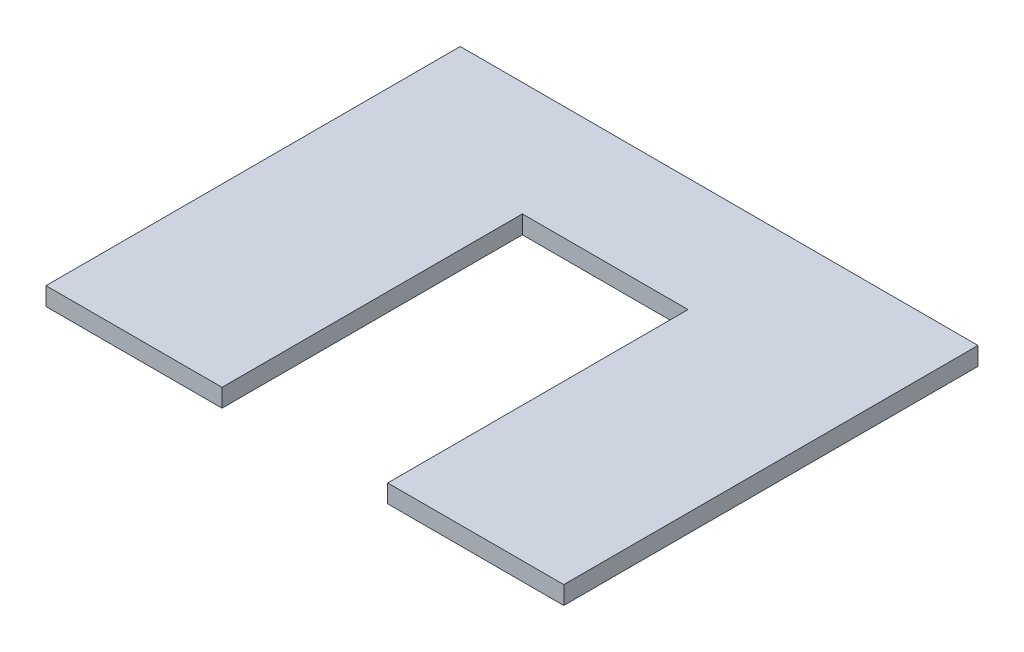
ISO-10303-21;
HEADER;
FILE_DESCRIPTION(('STEP AP214'),'2;1');
FILE_NAME('part.step','',(''),(''),'','','');
FILE_SCHEMA(('AUTOMOTIVE_DESIGN { 1 0 10303 214 1 1 1 1 }'));
ENDSEC;
DATA;
#1=APPLICATION_CONTEXT('core data for automotive mechanical design processes');
#2=APPLICATION_PROTOCOL_DEFINITION('international standard','automotive_design',2000,#1);
#3=PRODUCT_CONTEXT('',#1,'mechanical');
#4=PRODUCT('Part','Part','',(#3));
#5=PRODUCT_RELATED_PRODUCT_CATEGORY('part','',(#4));
#6=PRODUCT_DEFINITION_FORMATION('','',#4);
#7=PRODUCT_DEFINITION_CONTEXT('part definition',#1,'design');
#8=PRODUCT_DEFINITION('design','',#6,#7);
#9=PRODUCT_DEFINITION_SHAPE('','',#8);
#10=(LENGTH_UNIT() NAMED_UNIT(*) SI_UNIT(.MILLI.,.METRE.));
#11=(NAMED_UNIT(*) PLANE_ANGLE_UNIT() SI_UNIT($,.RADIAN.));
#12=(NAMED_UNIT(*) SI_UNIT($,.STERADIAN.) SOLID_ANGLE_UNIT());
#13=UNCERTAINTY_MEASURE_WITH_UNIT(LENGTH_MEASURE(1.E-05),#10,'distance_accuracy_value','');
#14=(GEOMETRIC_REPRESENTATION_CONTEXT(3) GLOBAL_UNCERTAINTY_ASSIGNED_CONTEXT((#13)) GLOBAL_UNIT_ASSIGNED_CONTEXT((#10,
#11,#12)) REPRESENTATION_CONTEXT('',''));
#15=CARTESIAN_POINT('',(0.,0.,0.));
#16=DIRECTION('',(0.,0.,1.));
#17=DIRECTION('',(1.,0.,0.));
#18=AXIS2_PLACEMENT_3D('',#15,#16,#17);
#19=CARTESIAN_POINT('',(0.,1.75,0.));
#20=DIRECTION('',(1.,0.,0.));
#21=DIRECTION('',(0.,0.,-1.));
#22=AXIS2_PLACEMENT_3D('',#19,#20,#21);
#23=PLANE('',#22);
#24=DIRECTION('',(0.,0.,1.));
#25=VECTOR('',#24,1.);
#26=CARTESIAN_POINT('',(0.,0.,0.));
#27=LINE('',#26,#25);
#28=CARTESIAN_POINT('',(0.,0.,0.));
#29=VERTEX_POINT('',#28);
#30=CARTESIAN_POINT('',(0.,0.,40.));
#31=VERTEX_POINT('',#30);
#32=EDGE_CURVE('E144',#29,#31,#27,.T.);
#33=ORIENTED_EDGE('',*,*,#32,.T.);
#34=DIRECTION('',(0.,-1.,0.));
#35=VECTOR('',#34,1.);
#36=CARTESIAN_POINT('',(0.,1.75,40.));
#37=LINE('',#36,#35);
#38=CARTESIAN_POINT('',(0.,1.75,40.));
#39=VERTEX_POINT('',#38);
#40=EDGE_CURVE('E11',#39,#31,#37,.T.);
#41=ORIENTED_EDGE('',*,*,#40,.F.);
#42=DIRECTION('',(0.,0.,1.));
#43=VECTOR('',#42,1.);
#44=CARTESIAN_POINT('',(0.,1.75,0.));
#45=LINE('',#44,#43);
#46=CARTESIAN_POINT('',(0.,1.75,0.));
#47=VERTEX_POINT('',#46);
#48=EDGE_CURVE('E166',#47,#39,#45,.T.);
#49=ORIENTED_EDGE('',*,*,#48,.F.);
#50=DIRECTION('',(0.,-1.,0.));
#51=VECTOR('',#50,1.);
#52=CARTESIAN_POINT('',(0.,1.75,0.));
#53=LINE('',#52,#51);
#54=EDGE_CURVE('E140',#47,#29,#53,.T.);
#55=ORIENTED_EDGE('',*,*,#54,.T.);
#56=EDGE_LOOP('',(#33,#41,#49,#55));
#57=FACE_BOUND('',#56,.T.);
#58=ADVANCED_FACE('F43',(#57),#23,.F.);
#59=CARTESIAN_POINT('',(0.,1.75,40.));
#60=DIRECTION('',(0.,0.,-1.));
#61=DIRECTION('',(-1.,0.,0.));
#62=AXIS2_PLACEMENT_3D('',#59,#60,#61);
#63=PLANE('',#62);
#64=DIRECTION('',(1.,0.,0.));
#65=VECTOR('',#64,1.);
#66=CARTESIAN_POINT('',(0.,0.,40.));
#67=LINE('',#66,#65);
#68=CARTESIAN_POINT('',(17.,0.,40.));
#69=VERTEX_POINT('',#68);
#70=EDGE_CURVE('E148',#31,#69,#67,.T.);
#71=ORIENTED_EDGE('',*,*,#70,.T.);
#72=DIRECTION('',(0.,-1.,0.));
#73=VECTOR('',#72,1.);
#74=CARTESIAN_POINT('',(17.,1.75,40.));
#75=LINE('',#74,#73);
#76=CARTESIAN_POINT('',(17.,1.75,40.));
#77=VERTEX_POINT('',#76);
#78=EDGE_CURVE('E52',#77,#69,#75,.T.);
#79=ORIENTED_EDGE('',*,*,#78,.F.);
#80=DIRECTION('',(1.,0.,0.));
#81=VECTOR('',#80,1.);
#82=CARTESIAN_POINT('',(0.,1.75,40.));
#83=LINE('',#82,#81);
#84=EDGE_CURVE('E103',#39,#77,#83,.T.);
#85=ORIENTED_EDGE('',*,*,#84,.F.);
#86=ORIENTED_EDGE('',*,*,#40,.T.);
#87=EDGE_LOOP('',(#71,#79,#85,#86));
#88=FACE_BOUND('',#87,.T.);
#89=ADVANCED_FACE('F212',(#88),#63,.F.);
#90=CARTESIAN_POINT('',(17.,1.75,40.));
#91=DIRECTION('',(-1.,0.,0.));
#92=DIRECTION('',(0.,0.,1.));
#93=AXIS2_PLACEMENT_3D('',#90,#91,#92);
#94=PLANE('',#93);
#95=DIRECTION('',(0.,0.,-1.));
#96=VECTOR('',#95,1.);
#97=CARTESIAN_POINT('',(17.,0.,40.));
#98=LINE('',#97,#96);
#99=CARTESIAN_POINT('',(17.,0.,11.));
#100=VERTEX_POINT('',#99);
#101=EDGE_CURVE('E151',#69,#100,#98,.T.);
#102=ORIENTED_EDGE('',*,*,#101,.T.);
#103=DIRECTION('',(0.,-1.,0.));
#104=VECTOR('',#103,1.);
#105=CARTESIAN_POINT('',(17.,1.75,11.));
#106=LINE('',#105,#104);
#107=CARTESIAN_POINT('',(17.,1.75,11.));
#108=VERTEX_POINT('',#107);
#109=EDGE_CURVE('E177',#108,#100,#106,.T.);
#110=ORIENTED_EDGE('',*,*,#109,.F.);
#111=DIRECTION('',(0.,0.,-1.));
#112=VECTOR('',#111,1.);
#113=CARTESIAN_POINT('',(17.,1.75,40.));
#114=LINE('',#113,#112);
#115=EDGE_CURVE('E187',#77,#108,#114,.T.);
#116=ORIENTED_EDGE('',*,*,#115,.F.);
#117=ORIENTED_EDGE('',*,*,#78,.T.);
#118=EDGE_LOOP('',(#102,#110,#116,#117));
#119=FACE_BOUND('',#118,.T.);
#120=ADVANCED_FACE('F185',(#119),#94,.F.);
#121=CARTESIAN_POINT('',(17.,1.75,11.));
#122=DIRECTION('',(0.,0.,-1.));
#123=DIRECTION('',(-1.,0.,0.));
#124=AXIS2_PLACEMENT_3D('',#121,#122,#123);
#125=PLANE('',#124);
#126=DIRECTION('',(1.,0.,0.));
#127=VECTOR('',#126,1.);
#128=CARTESIAN_POINT('',(17.,0.,11.));
#129=LINE('',#128,#127);
#130=CARTESIAN_POINT('',(33.,0.,11.));
#131=VERTEX_POINT('',#130);
#132=EDGE_CURVE('E154',#100,#131,#129,.T.);
#133=ORIENTED_EDGE('',*,*,#132,.T.);
#134=DIRECTION('',(0.,-1.,0.));
#135=VECTOR('',#134,1.);
#136=CARTESIAN_POINT('',(33.,1.75,11.));
#137=LINE('',#136,#135);
#138=CARTESIAN_POINT('',(33.,1.75,11.));
#139=VERTEX_POINT('',#138);
#140=EDGE_CURVE('E173',#139,#131,#137,.T.);
#141=ORIENTED_EDGE('',*,*,#140,.F.);
#142=DIRECTION('',(1.,0.,0.));
#143=VECTOR('',#142,1.);
#144=CARTESIAN_POINT('',(17.,1.75,11.));
#145=LINE('',#144,#143);
#146=EDGE_CURVE('E200',#108,#139,#145,.T.);
#147=ORIENTED_EDGE('',*,*,#146,.F.);
#148=ORIENTED_EDGE('',*,*,#109,.T.);
#149=EDGE_LOOP('',(#133,#141,#147,#148));
#150=FACE_BOUND('',#149,.T.);
#151=ADVANCED_FACE('F195',(#150),#125,.F.);
#152=CARTESIAN_POINT('',(33.,1.75,11.));
#153=DIRECTION('',(1.,0.,0.));
#154=DIRECTION('',(0.,0.,-1.));
#155=AXIS2_PLACEMENT_3D('',#152,#153,#154);
#156=PLANE('',#155);
#157=DIRECTION('',(0.,0.,1.));
#158=VECTOR('',#157,1.);
#159=CARTESIAN_POINT('',(33.,0.,11.));
#160=LINE('',#159,#158);
#161=CARTESIAN_POINT('',(33.,0.,40.));
#162=VERTEX_POINT('',#161);
#163=EDGE_CURVE('E157',#131,#162,#160,.T.);
#164=ORIENTED_EDGE('',*,*,#163,.T.);
#165=DIRECTION('',(0.,-1.,0.));
#166=VECTOR('',#165,1.);
#167=CARTESIAN_POINT('',(33.,1.75,40.));
#168=LINE('',#167,#166);
#169=CARTESIAN_POINT('',(33.,1.75,40.));
#170=VERTEX_POINT('',#169);
#171=EDGE_CURVE('E133',#170,#162,#168,.T.);
#172=ORIENTED_EDGE('',*,*,#171,.F.);
#173=DIRECTION('',(0.,0.,1.));
#174=VECTOR('',#173,1.);
#175=CARTESIAN_POINT('',(33.,1.75,11.));
#176=LINE('',#175,#174);
#177=EDGE_CURVE('E122',#139,#170,#176,.T.);
#178=ORIENTED_EDGE('',*,*,#177,.F.);
#179=ORIENTED_EDGE('',*,*,#140,.T.);
#180=EDGE_LOOP('',(#164,#172,#178,#179));
#181=FACE_BOUND('',#180,.T.);
#182=ADVANCED_FACE('F198',(#181),#156,.F.);
#183=CARTESIAN_POINT('',(33.,1.75,40.));
#184=DIRECTION('',(0.,0.,-1.));
#185=DIRECTION('',(-1.,0.,0.));
#186=AXIS2_PLACEMENT_3D('',#183,#184,#185);
#187=PLANE('',#186);
#188=DIRECTION('',(1.,0.,0.));
#189=VECTOR('',#188,1.);
#190=CARTESIAN_POINT('',(33.,0.,40.));
#191=LINE('',#190,#189);
#192=CARTESIAN_POINT('',(50.,0.,40.));
#193=VERTEX_POINT('',#192);
#194=EDGE_CURVE('E131',#162,#193,#191,.T.);
#195=ORIENTED_EDGE('',*,*,#194,.T.);
#196=DIRECTION('',(0.,-1.,0.));
#197=VECTOR('',#196,1.);
#198=CARTESIAN_POINT('',(50.,1.75,40.));
#199=LINE('',#198,#197);
#200=CARTESIAN_POINT('',(50.,1.75,40.));
#201=VERTEX_POINT('',#200);
#202=EDGE_CURVE('E128',#201,#193,#199,.T.);
#203=ORIENTED_EDGE('',*,*,#202,.F.);
#204=DIRECTION('',(1.,0.,0.));
#205=VECTOR('',#204,1.);
#206=CARTESIAN_POINT('',(33.,1.75,40.));
#207=LINE('',#206,#205);
#208=EDGE_CURVE('E116',#170,#201,#207,.T.);
#209=ORIENTED_EDGE('',*,*,#208,.F.);
#210=ORIENTED_EDGE('',*,*,#171,.T.);
#211=EDGE_LOOP('',(#195,#203,#209,#210));
#212=FACE_BOUND('',#211,.T.);
#213=ADVANCED_FACE('F129',(#212),#187,.F.);
#214=CARTESIAN_POINT('',(50.,1.75,0.));
#215=DIRECTION('',(-1.,0.,0.));
#216=DIRECTION('',(0.,0.,1.));
#217=AXIS2_PLACEMENT_3D('',#214,#215,#216);
#218=PLANE('',#217);
#219=DIRECTION('',(0.,0.,-1.));
#220=VECTOR('',#219,1.);
#221=CARTESIAN_POINT('',(50.,0.,0.));
#222=LINE('',#221,#220);
#223=CARTESIAN_POINT('',(50.,0.,0.));
#224=VERTEX_POINT('',#223);
#225=EDGE_CURVE('E89',#193,#224,#222,.T.);
#226=ORIENTED_EDGE('',*,*,#225,.T.);
#227=DIRECTION('',(0.,-1.,0.));
#228=VECTOR('',#227,1.);
#229=CARTESIAN_POINT('',(50.,1.75,0.));
#230=LINE('',#229,#228);
#231=CARTESIAN_POINT('',(50.,1.75,0.));
#232=VERTEX_POINT('',#231);
#233=EDGE_CURVE('E134',#232,#224,#230,.T.);
#234=ORIENTED_EDGE('',*,*,#233,.F.);
#235=DIRECTION('',(0.,0.,-1.));
#236=VECTOR('',#235,1.);
#237=CARTESIAN_POINT('',(50.,1.75,0.));
#238=LINE('',#237,#236);
#239=EDGE_CURVE('E120',#201,#232,#238,.T.);
#240=ORIENTED_EDGE('',*,*,#239,.F.);
#241=ORIENTED_EDGE('',*,*,#202,.T.);
#242=EDGE_LOOP('',(#226,#234,#240,#241));
#243=FACE_BOUND('',#242,.T.);
#244=ADVANCED_FACE('F136',(#243),#218,.F.);
#245=CARTESIAN_POINT('',(0.,1.75,0.));
#246=DIRECTION('',(0.,0.,1.));
#247=DIRECTION('',(1.,0.,0.));
#248=AXIS2_PLACEMENT_3D('',#245,#246,#247);
#249=PLANE('',#248);
#250=DIRECTION('',(-1.,0.,0.));
#251=VECTOR('',#250,1.);
#252=CARTESIAN_POINT('',(0.,0.,0.));
#253=LINE('',#252,#251);
#254=EDGE_CURVE('E95',#224,#29,#253,.T.);
#255=ORIENTED_EDGE('',*,*,#254,.T.);
#256=ORIENTED_EDGE('',*,*,#54,.F.);
#257=DIRECTION('',(-1.,0.,0.));
#258=VECTOR('',#257,1.);
#259=CARTESIAN_POINT('',(0.,1.75,0.));
#260=LINE('',#259,#258);
#261=EDGE_CURVE('E60',#232,#47,#260,.T.);
#262=ORIENTED_EDGE('',*,*,#261,.F.);
#263=ORIENTED_EDGE('',*,*,#233,.T.);
#264=EDGE_LOOP('',(#255,#256,#262,#263));
#265=FACE_BOUND('',#264,.T.);
#266=ADVANCED_FACE('F228',(#265),#249,.F.);
#267=CARTESIAN_POINT('',(0.,1.75,0.));
#268=DIRECTION('',(0.,1.,0.));
#269=DIRECTION('',(0.,0.,1.));
#270=AXIS2_PLACEMENT_3D('',#267,#268,#269);
#271=PLANE('',#270);
#272=ORIENTED_EDGE('',*,*,#48,.T.);
#273=ORIENTED_EDGE('',*,*,#84,.T.);
#274=ORIENTED_EDGE('',*,*,#115,.T.);
#275=ORIENTED_EDGE('',*,*,#146,.T.);
#276=ORIENTED_EDGE('',*,*,#177,.T.);
#277=ORIENTED_EDGE('',*,*,#208,.T.);
#278=ORIENTED_EDGE('',*,*,#239,.T.);
#279=ORIENTED_EDGE('',*,*,#261,.T.);
#280=EDGE_LOOP('',(#272,#273,#274,#275,#276,#277,#278,#279));
#281=FACE_BOUND('',#280,.T.);
#282=ADVANCED_FACE('F118',(#281),#271,.T.);
#283=CARTESIAN_POINT('',(0.,0.,0.));
#284=DIRECTION('',(0.,1.,0.));
#285=DIRECTION('',(0.,0.,1.));
#286=AXIS2_PLACEMENT_3D('',#283,#284,#285);
#287=PLANE('',#286);
#288=ORIENTED_EDGE('',*,*,#32,.F.);
#289=ORIENTED_EDGE('',*,*,#254,.F.);
#290=ORIENTED_EDGE('',*,*,#225,.F.);
#291=ORIENTED_EDGE('',*,*,#194,.F.);
#292=ORIENTED_EDGE('',*,*,#163,.F.);
#293=ORIENTED_EDGE('',*,*,#132,.F.);
#294=ORIENTED_EDGE('',*,*,#101,.F.);
#295=ORIENTED_EDGE('',*,*,#70,.F.);
#296=EDGE_LOOP('',(#288,#289,#290,#291,#292,#293,#294,#295));
#297=FACE_BOUND('',#296,.T.);
#298=ADVANCED_FACE('F191',(#297),#287,.F.);
#299=CLOSED_SHELL('',(#58,#89,#120,#151,#182,#213,#244,#266,#282,#298));
#300=MANIFOLD_SOLID_BREP('B2',#299);
#301=ADVANCED_BREP_SHAPE_REPRESENTATION('',(#18,#300),#14);
#302=SHAPE_DEFINITION_REPRESENTATION(#9,#301);
ENDSEC;
END-ISO-10303-21;
